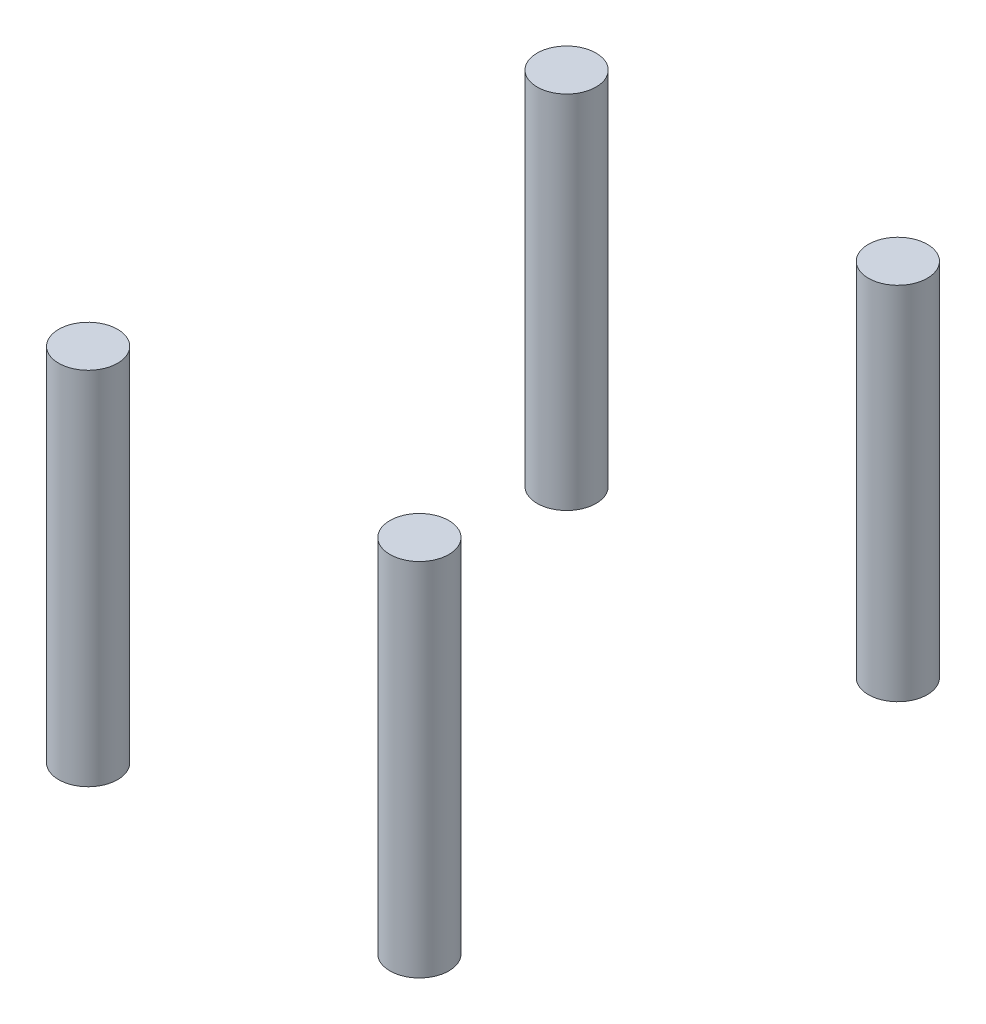
ISO-10303-21;
HEADER;
FILE_DESCRIPTION(('STEP AP214'),'2;1');
FILE_NAME('part.step','',(''),(''),'','','');
FILE_SCHEMA(('AUTOMOTIVE_DESIGN { 1 0 10303 214 1 1 1 1 }'));
ENDSEC;
DATA;
#1=APPLICATION_CONTEXT('core data for automotive mechanical design processes');
#2=APPLICATION_PROTOCOL_DEFINITION('international standard','automotive_design',2000,#1);
#3=PRODUCT_CONTEXT('',#1,'mechanical');
#4=PRODUCT('Part','Part','',(#3));
#5=PRODUCT_RELATED_PRODUCT_CATEGORY('part','',(#4));
#6=PRODUCT_DEFINITION_FORMATION('','',#4);
#7=PRODUCT_DEFINITION_CONTEXT('part definition',#1,'design');
#8=PRODUCT_DEFINITION('design','',#6,#7);
#9=PRODUCT_DEFINITION_SHAPE('','',#8);
#10=(LENGTH_UNIT() NAMED_UNIT(*) SI_UNIT(.MILLI.,.METRE.));
#11=(NAMED_UNIT(*) PLANE_ANGLE_UNIT() SI_UNIT($,.RADIAN.));
#12=(NAMED_UNIT(*) SI_UNIT($,.STERADIAN.) SOLID_ANGLE_UNIT());
#13=UNCERTAINTY_MEASURE_WITH_UNIT(LENGTH_MEASURE(1.E-05),#10,'distance_accuracy_value','');
#14=(GEOMETRIC_REPRESENTATION_CONTEXT(3) GLOBAL_UNCERTAINTY_ASSIGNED_CONTEXT((#13)) GLOBAL_UNIT_ASSIGNED_CONTEXT((#10,
#11,#12)) REPRESENTATION_CONTEXT('',''));
#15=CARTESIAN_POINT('',(0.,0.,0.));
#16=DIRECTION('',(0.,0.,1.));
#17=DIRECTION('',(1.,0.,0.));
#18=AXIS2_PLACEMENT_3D('',#15,#16,#17);
#19=CARTESIAN_POINT('',(-22.5,49.,32.5));
#20=DIRECTION('',(0.,-1.,0.));
#21=DIRECTION('',(0.,0.,-1.));
#22=AXIS2_PLACEMENT_3D('',#19,#20,#21);
#23=CYLINDRICAL_SURFACE('',#22,3.99999999999999);
#24=CARTESIAN_POINT('',(-22.5,49.,32.5));
#25=DIRECTION('',(0.,-1.,0.));
#26=DIRECTION('',(0.,0.,-1.));
#27=AXIS2_PLACEMENT_3D('',#24,#25,#26);
#28=CIRCLE('',#27,3.99999999999999);
#29=CARTESIAN_POINT('',(-22.5,49.,28.5));
#30=VERTEX_POINT('',#29);
#31=EDGE_CURVE('E52',#30,#30,#28,.T.);
#32=ORIENTED_EDGE('',*,*,#31,.T.);
#33=EDGE_LOOP('',(#32));
#34=FACE_BOUND('',#33,.T.);
#35=CARTESIAN_POINT('',(-22.5,0.,32.5));
#36=DIRECTION('',(0.,-1.,0.));
#37=DIRECTION('',(0.,0.,-1.));
#38=AXIS2_PLACEMENT_3D('',#35,#36,#37);
#39=CIRCLE('',#38,3.99999999999999);
#40=CARTESIAN_POINT('',(-22.5,0.,28.5));
#41=VERTEX_POINT('',#40);
#42=EDGE_CURVE('E11',#41,#41,#39,.T.);
#43=ORIENTED_EDGE('',*,*,#42,.F.);
#44=EDGE_LOOP('',(#43));
#45=FACE_BOUND('',#44,.T.);
#46=ADVANCED_FACE('F48',(#34,#45),#23,.T.);
#47=CARTESIAN_POINT('',(-22.5,49.,32.5));
#48=DIRECTION('',(0.,-1.,0.));
#49=DIRECTION('',(0.,0.,-1.));
#50=AXIS2_PLACEMENT_3D('',#47,#48,#49);
#51=PLANE('',#50);
#52=ORIENTED_EDGE('',*,*,#31,.F.);
#53=EDGE_LOOP('',(#52));
#54=FACE_BOUND('',#53,.T.);
#55=ADVANCED_FACE('F50',(#54),#51,.F.);
#56=CARTESIAN_POINT('',(-22.5,0.,32.5));
#57=DIRECTION('',(0.,-1.,0.));
#58=DIRECTION('',(0.,0.,-1.));
#59=AXIS2_PLACEMENT_3D('',#56,#57,#58);
#60=PLANE('',#59);
#61=ORIENTED_EDGE('',*,*,#42,.T.);
#62=EDGE_LOOP('',(#61));
#63=FACE_BOUND('',#62,.T.);
#64=ADVANCED_FACE('F66',(#63),#60,.T.);
#65=CLOSED_SHELL('',(#46,#55,#64));
#66=MANIFOLD_SOLID_BREP('B2',#65);
#67=CARTESIAN_POINT('',(-22.5,49.,-32.5));
#68=DIRECTION('',(0.,-1.,0.));
#69=DIRECTION('',(0.,0.,-1.));
#70=AXIS2_PLACEMENT_3D('',#67,#68,#69);
#71=CYLINDRICAL_SURFACE('',#70,3.99999999999999);
#72=CARTESIAN_POINT('',(-22.5,49.,-32.5));
#73=DIRECTION('',(0.,-1.,0.));
#74=DIRECTION('',(0.,0.,-1.));
#75=AXIS2_PLACEMENT_3D('',#72,#73,#74);
#76=CIRCLE('',#75,3.99999999999999);
#77=CARTESIAN_POINT('',(-22.5,49.,-36.5));
#78=VERTEX_POINT('',#77);
#79=EDGE_CURVE('E103',#78,#78,#76,.T.);
#80=ORIENTED_EDGE('',*,*,#79,.T.);
#81=EDGE_LOOP('',(#80));
#82=FACE_BOUND('',#81,.T.);
#83=CARTESIAN_POINT('',(-22.5,0.,-32.5));
#84=DIRECTION('',(0.,-1.,0.));
#85=DIRECTION('',(0.,0.,-1.));
#86=AXIS2_PLACEMENT_3D('',#83,#84,#85);
#87=CIRCLE('',#86,3.99999999999999);
#88=CARTESIAN_POINT('',(-22.5,0.,-36.5));
#89=VERTEX_POINT('',#88);
#90=EDGE_CURVE('E47',#89,#89,#87,.T.);
#91=ORIENTED_EDGE('',*,*,#90,.F.);
#92=EDGE_LOOP('',(#91));
#93=FACE_BOUND('',#92,.T.);
#94=ADVANCED_FACE('F99',(#82,#93),#71,.T.);
#95=CARTESIAN_POINT('',(-22.5,49.,-32.5));
#96=DIRECTION('',(0.,-1.,0.));
#97=DIRECTION('',(0.,0.,-1.));
#98=AXIS2_PLACEMENT_3D('',#95,#96,#97);
#99=PLANE('',#98);
#100=ORIENTED_EDGE('',*,*,#79,.F.);
#101=EDGE_LOOP('',(#100));
#102=FACE_BOUND('',#101,.T.);
#103=ADVANCED_FACE('F101',(#102),#99,.F.);
#104=CARTESIAN_POINT('',(-22.5,0.,-32.5));
#105=DIRECTION('',(0.,-1.,0.));
#106=DIRECTION('',(0.,0.,-1.));
#107=AXIS2_PLACEMENT_3D('',#104,#105,#106);
#108=PLANE('',#107);
#109=ORIENTED_EDGE('',*,*,#90,.T.);
#110=EDGE_LOOP('',(#109));
#111=FACE_BOUND('',#110,.T.);
#112=ADVANCED_FACE('F115',(#111),#108,.T.);
#113=CLOSED_SHELL('',(#94,#103,#112));
#114=MANIFOLD_SOLID_BREP('B6',#113);
#115=CARTESIAN_POINT('',(22.5,49.,-32.5));
#116=DIRECTION('',(0.,-1.,0.));
#117=DIRECTION('',(0.,0.,-1.));
#118=AXIS2_PLACEMENT_3D('',#115,#116,#117);
#119=CYLINDRICAL_SURFACE('',#118,3.99999999999999);
#120=CARTESIAN_POINT('',(22.5,49.,-32.5));
#121=DIRECTION('',(0.,1.,0.));
#122=DIRECTION('',(0.,0.,1.));
#123=AXIS2_PLACEMENT_3D('',#120,#121,#122);
#124=CIRCLE('',#123,3.99999999999999);
#125=CARTESIAN_POINT('',(22.5,49.,-28.5));
#126=VERTEX_POINT('',#125);
#127=EDGE_CURVE('E151',#126,#126,#124,.T.);
#128=ORIENTED_EDGE('',*,*,#127,.F.);
#129=EDGE_LOOP('',(#128));
#130=FACE_BOUND('',#129,.T.);
#131=CARTESIAN_POINT('',(22.5,0.,-32.5));
#132=DIRECTION('',(0.,1.,0.));
#133=DIRECTION('',(0.,0.,1.));
#134=AXIS2_PLACEMENT_3D('',#131,#132,#133);
#135=CIRCLE('',#134,3.99999999999999);
#136=CARTESIAN_POINT('',(22.5,0.,-28.5));
#137=VERTEX_POINT('',#136);
#138=EDGE_CURVE('E98',#137,#137,#135,.T.);
#139=ORIENTED_EDGE('',*,*,#138,.T.);
#140=EDGE_LOOP('',(#139));
#141=FACE_BOUND('',#140,.T.);
#142=ADVANCED_FACE('F147',(#130,#141),#119,.T.);
#143=CARTESIAN_POINT('',(0.,49.,0.));
#144=DIRECTION('',(0.,1.,0.));
#145=DIRECTION('',(0.,0.,1.));
#146=AXIS2_PLACEMENT_3D('',#143,#144,#145);
#147=PLANE('',#146);
#148=ORIENTED_EDGE('',*,*,#127,.T.);
#149=EDGE_LOOP('',(#148));
#150=FACE_BOUND('',#149,.T.);
#151=ADVANCED_FACE('F149',(#150),#147,.T.);
#152=CARTESIAN_POINT('',(0.,0.,0.));
#153=DIRECTION('',(0.,1.,0.));
#154=DIRECTION('',(0.,0.,1.));
#155=AXIS2_PLACEMENT_3D('',#152,#153,#154);
#156=PLANE('',#155);
#157=ORIENTED_EDGE('',*,*,#138,.F.);
#158=EDGE_LOOP('',(#157));
#159=FACE_BOUND('',#158,.T.);
#160=ADVANCED_FACE('F166',(#159),#156,.F.);
#161=CLOSED_SHELL('',(#142,#151,#160));
#162=MANIFOLD_SOLID_BREP('B42',#161);
#163=CARTESIAN_POINT('',(22.5,49.,32.5));
#164=DIRECTION('',(0.,-1.,0.));
#165=DIRECTION('',(0.,0.,-1.));
#166=AXIS2_PLACEMENT_3D('',#163,#164,#165);
#167=CYLINDRICAL_SURFACE('',#166,3.99999999999999);
#168=CARTESIAN_POINT('',(22.5,49.,32.5));
#169=DIRECTION('',(0.,1.,0.));
#170=DIRECTION('',(0.,0.,1.));
#171=AXIS2_PLACEMENT_3D('',#168,#169,#170);
#172=CIRCLE('',#171,3.99999999999999);
#173=CARTESIAN_POINT('',(22.5,49.,36.5));
#174=VERTEX_POINT('',#173);
#175=EDGE_CURVE('E146',#174,#174,#172,.T.);
#176=ORIENTED_EDGE('',*,*,#175,.F.);
#177=EDGE_LOOP('',(#176));
#178=FACE_BOUND('',#177,.T.);
#179=CARTESIAN_POINT('',(22.5,0.,32.5));
#180=DIRECTION('',(0.,1.,0.));
#181=DIRECTION('',(0.,0.,1.));
#182=AXIS2_PLACEMENT_3D('',#179,#180,#181);
#183=CIRCLE('',#182,3.99999999999999);
#184=CARTESIAN_POINT('',(22.5,0.,36.5));
#185=VERTEX_POINT('',#184);
#186=EDGE_CURVE('E191',#185,#185,#183,.T.);
#187=ORIENTED_EDGE('',*,*,#186,.T.);
#188=EDGE_LOOP('',(#187));
#189=FACE_BOUND('',#188,.T.);
#190=ADVANCED_FACE('F188',(#178,#189),#167,.T.);
#191=CARTESIAN_POINT('',(0.,49.,0.));
#192=DIRECTION('',(0.,1.,0.));
#193=DIRECTION('',(0.,0.,1.));
#194=AXIS2_PLACEMENT_3D('',#191,#192,#193);
#195=PLANE('',#194);
#196=ORIENTED_EDGE('',*,*,#175,.T.);
#197=EDGE_LOOP('',(#196));
#198=FACE_BOUND('',#197,.T.);
#199=ADVANCED_FACE('F203',(#198),#195,.T.);
#200=CARTESIAN_POINT('',(0.,0.,0.));
#201=DIRECTION('',(0.,1.,0.));
#202=DIRECTION('',(0.,0.,1.));
#203=AXIS2_PLACEMENT_3D('',#200,#201,#202);
#204=PLANE('',#203);
#205=ORIENTED_EDGE('',*,*,#186,.F.);
#206=EDGE_LOOP('',(#205));
#207=FACE_BOUND('',#206,.T.);
#208=ADVANCED_FACE('F201',(#207),#204,.F.);
#209=CLOSED_SHELL('',(#190,#199,#208));
#210=MANIFOLD_SOLID_BREP('B93',#209);
#211=ADVANCED_BREP_SHAPE_REPRESENTATION('',(#18,#66,#114,#162,#210),#14);
#212=SHAPE_DEFINITION_REPRESENTATION(#9,#211);
ENDSEC;
END-ISO-10303-21;
